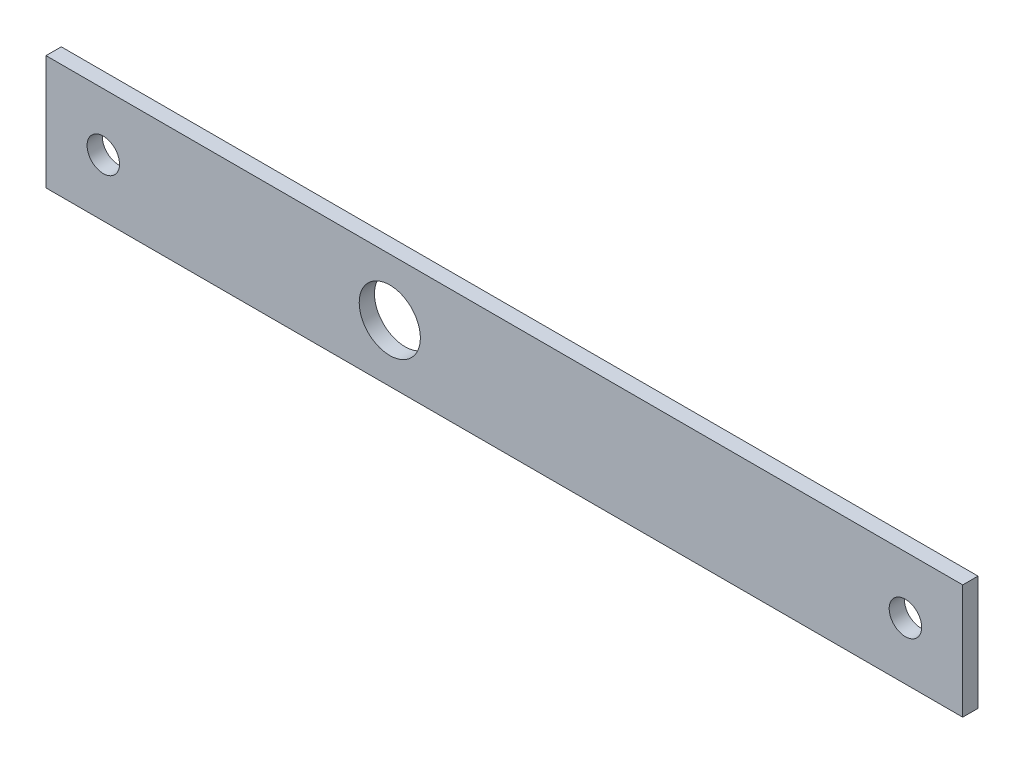
ISO-10303-21;
HEADER;
FILE_DESCRIPTION(('STEP AP214'),'2;1');
FILE_NAME('part.step','',(''),(''),'','','');
FILE_SCHEMA(('AUTOMOTIVE_DESIGN { 1 0 10303 214 1 1 1 1 }'));
ENDSEC;
DATA;
#1=APPLICATION_CONTEXT('core data for automotive mechanical design processes');
#2=APPLICATION_PROTOCOL_DEFINITION('international standard','automotive_design',2000,#1);
#3=PRODUCT_CONTEXT('',#1,'mechanical');
#4=PRODUCT('Part','Part','',(#3));
#5=PRODUCT_RELATED_PRODUCT_CATEGORY('part','',(#4));
#6=PRODUCT_DEFINITION_FORMATION('','',#4);
#7=PRODUCT_DEFINITION_CONTEXT('part definition',#1,'design');
#8=PRODUCT_DEFINITION('design','',#6,#7);
#9=PRODUCT_DEFINITION_SHAPE('','',#8);
#10=(LENGTH_UNIT() NAMED_UNIT(*) SI_UNIT(.MILLI.,.METRE.));
#11=(NAMED_UNIT(*) PLANE_ANGLE_UNIT() SI_UNIT($,.RADIAN.));
#12=(NAMED_UNIT(*) SI_UNIT($,.STERADIAN.) SOLID_ANGLE_UNIT());
#13=UNCERTAINTY_MEASURE_WITH_UNIT(LENGTH_MEASURE(1.E-05),#10,'distance_accuracy_value','');
#14=(GEOMETRIC_REPRESENTATION_CONTEXT(3) GLOBAL_UNCERTAINTY_ASSIGNED_CONTEXT((#13)) GLOBAL_UNIT_ASSIGNED_CONTEXT((#10,
#11,#12)) REPRESENTATION_CONTEXT('',''));
#15=CARTESIAN_POINT('',(0.,0.,0.));
#16=DIRECTION('',(0.,0.,1.));
#17=DIRECTION('',(1.,0.,0.));
#18=AXIS2_PLACEMENT_3D('',#15,#16,#17);
#19=CARTESIAN_POINT('',(0.,0.,4.));
#20=DIRECTION('',(1.,0.,0.));
#21=DIRECTION('',(0.,0.,-1.));
#22=AXIS2_PLACEMENT_3D('',#19,#20,#21);
#23=PLANE('',#22);
#24=DIRECTION('',(0.,-1.,0.));
#25=VECTOR('',#24,1.);
#26=CARTESIAN_POINT('',(0.,0.,0.));
#27=LINE('',#26,#25);
#28=CARTESIAN_POINT('',(0.,30.,0.));
#29=VERTEX_POINT('',#28);
#30=CARTESIAN_POINT('',(0.,0.,0.));
#31=VERTEX_POINT('',#30);
#32=EDGE_CURVE('E98',#29,#31,#27,.T.);
#33=ORIENTED_EDGE('',*,*,#32,.T.);
#34=DIRECTION('',(0.,0.,-1.));
#35=VECTOR('',#34,1.);
#36=CARTESIAN_POINT('',(0.,0.,4.));
#37=LINE('',#36,#35);
#38=CARTESIAN_POINT('',(0.,0.,4.));
#39=VERTEX_POINT('',#38);
#40=EDGE_CURVE('E11',#39,#31,#37,.T.);
#41=ORIENTED_EDGE('',*,*,#40,.F.);
#42=DIRECTION('',(0.,-1.,0.));
#43=VECTOR('',#42,1.);
#44=CARTESIAN_POINT('',(0.,0.,4.));
#45=LINE('',#44,#43);
#46=CARTESIAN_POINT('',(0.,30.,4.));
#47=VERTEX_POINT('',#46);
#48=EDGE_CURVE('E86',#47,#39,#45,.T.);
#49=ORIENTED_EDGE('',*,*,#48,.F.);
#50=DIRECTION('',(0.,0.,-1.));
#51=VECTOR('',#50,1.);
#52=CARTESIAN_POINT('',(0.,30.,4.));
#53=LINE('',#52,#51);
#54=EDGE_CURVE('E94',#47,#29,#53,.T.);
#55=ORIENTED_EDGE('',*,*,#54,.T.);
#56=EDGE_LOOP('',(#33,#41,#49,#55));
#57=FACE_BOUND('',#56,.T.);
#58=ADVANCED_FACE('F35',(#57),#23,.F.);
#59=CARTESIAN_POINT('',(0.,0.,4.));
#60=DIRECTION('',(0.,1.,0.));
#61=DIRECTION('',(0.,0.,1.));
#62=AXIS2_PLACEMENT_3D('',#59,#60,#61);
#63=PLANE('',#62);
#64=DIRECTION('',(1.,0.,0.));
#65=VECTOR('',#64,1.);
#66=CARTESIAN_POINT('',(0.,0.,0.));
#67=LINE('',#66,#65);
#68=CARTESIAN_POINT('',(240.,0.,0.));
#69=VERTEX_POINT('',#68);
#70=EDGE_CURVE('E90',#31,#69,#67,.T.);
#71=ORIENTED_EDGE('',*,*,#70,.T.);
#72=DIRECTION('',(0.,0.,-1.));
#73=VECTOR('',#72,1.);
#74=CARTESIAN_POINT('',(240.,0.,4.));
#75=LINE('',#74,#73);
#76=CARTESIAN_POINT('',(240.,0.,4.));
#77=VERTEX_POINT('',#76);
#78=EDGE_CURVE('E43',#77,#69,#75,.T.);
#79=ORIENTED_EDGE('',*,*,#78,.F.);
#80=DIRECTION('',(1.,0.,0.));
#81=VECTOR('',#80,1.);
#82=CARTESIAN_POINT('',(0.,0.,4.));
#83=LINE('',#82,#81);
#84=EDGE_CURVE('E81',#39,#77,#83,.T.);
#85=ORIENTED_EDGE('',*,*,#84,.F.);
#86=ORIENTED_EDGE('',*,*,#40,.T.);
#87=EDGE_LOOP('',(#71,#79,#85,#86));
#88=FACE_BOUND('',#87,.T.);
#89=ADVANCED_FACE('F89',(#88),#63,.F.);
#90=CARTESIAN_POINT('',(240.,0.,4.));
#91=DIRECTION('',(-1.,0.,0.));
#92=DIRECTION('',(0.,0.,1.));
#93=AXIS2_PLACEMENT_3D('',#90,#91,#92);
#94=PLANE('',#93);
#95=DIRECTION('',(0.,1.,0.));
#96=VECTOR('',#95,1.);
#97=CARTESIAN_POINT('',(240.,0.,0.));
#98=LINE('',#97,#96);
#99=CARTESIAN_POINT('',(240.,30.,0.));
#100=VERTEX_POINT('',#99);
#101=EDGE_CURVE('E68',#69,#100,#98,.T.);
#102=ORIENTED_EDGE('',*,*,#101,.T.);
#103=DIRECTION('',(0.,0.,-1.));
#104=VECTOR('',#103,1.);
#105=CARTESIAN_POINT('',(240.,30.,4.));
#106=LINE('',#105,#104);
#107=CARTESIAN_POINT('',(240.,30.,4.));
#108=VERTEX_POINT('',#107);
#109=EDGE_CURVE('E91',#108,#100,#106,.T.);
#110=ORIENTED_EDGE('',*,*,#109,.F.);
#111=DIRECTION('',(0.,1.,0.));
#112=VECTOR('',#111,1.);
#113=CARTESIAN_POINT('',(240.,0.,4.));
#114=LINE('',#113,#112);
#115=EDGE_CURVE('E84',#77,#108,#114,.T.);
#116=ORIENTED_EDGE('',*,*,#115,.F.);
#117=ORIENTED_EDGE('',*,*,#78,.T.);
#118=EDGE_LOOP('',(#102,#110,#116,#117));
#119=FACE_BOUND('',#118,.T.);
#120=ADVANCED_FACE('F92',(#119),#94,.F.);
#121=CARTESIAN_POINT('',(0.,30.,4.));
#122=DIRECTION('',(0.,-1.,0.));
#123=DIRECTION('',(0.,0.,-1.));
#124=AXIS2_PLACEMENT_3D('',#121,#122,#123);
#125=PLANE('',#124);
#126=DIRECTION('',(-1.,0.,0.));
#127=VECTOR('',#126,1.);
#128=CARTESIAN_POINT('',(0.,30.,0.));
#129=LINE('',#128,#127);
#130=EDGE_CURVE('E74',#100,#29,#129,.T.);
#131=ORIENTED_EDGE('',*,*,#130,.T.);
#132=ORIENTED_EDGE('',*,*,#54,.F.);
#133=DIRECTION('',(-1.,0.,0.));
#134=VECTOR('',#133,1.);
#135=CARTESIAN_POINT('',(0.,30.,4.));
#136=LINE('',#135,#134);
#137=EDGE_CURVE('E51',#108,#47,#136,.T.);
#138=ORIENTED_EDGE('',*,*,#137,.F.);
#139=ORIENTED_EDGE('',*,*,#109,.T.);
#140=EDGE_LOOP('',(#131,#132,#138,#139));
#141=FACE_BOUND('',#140,.T.);
#142=ADVANCED_FACE('F106',(#141),#125,.F.);
#143=CARTESIAN_POINT('',(0.,0.,4.));
#144=DIRECTION('',(0.,0.,-1.));
#145=DIRECTION('',(-1.,0.,0.));
#146=AXIS2_PLACEMENT_3D('',#143,#144,#145);
#147=PLANE('',#146);
#148=CARTESIAN_POINT('',(90.,15.,4.));
#149=DIRECTION('',(0.,0.,-1.));
#150=DIRECTION('',(-1.,0.,0.));
#151=AXIS2_PLACEMENT_3D('',#148,#149,#150);
#152=CIRCLE('',#151,8.00000000000001);
#153=CARTESIAN_POINT('',(82.,15.,4.));
#154=VERTEX_POINT('',#153);
#155=EDGE_CURVE('E116',#154,#154,#152,.T.);
#156=ORIENTED_EDGE('',*,*,#155,.T.);
#157=EDGE_LOOP('',(#156));
#158=FACE_BOUND('',#157,.T.);
#159=CARTESIAN_POINT('',(225.,15.,4.));
#160=DIRECTION('',(0.,0.,1.));
#161=DIRECTION('',(1.,0.,0.));
#162=AXIS2_PLACEMENT_3D('',#159,#160,#161);
#163=CIRCLE('',#162,4.24999999999995);
#164=CARTESIAN_POINT('',(229.25,15.,4.));
#165=VERTEX_POINT('',#164);
#166=EDGE_CURVE('E119',#165,#165,#163,.T.);
#167=ORIENTED_EDGE('',*,*,#166,.F.);
#168=EDGE_LOOP('',(#167));
#169=FACE_BOUND('',#168,.T.);
#170=CARTESIAN_POINT('',(15.,15.,4.));
#171=DIRECTION('',(0.,0.,1.));
#172=DIRECTION('',(1.,0.,0.));
#173=AXIS2_PLACEMENT_3D('',#170,#171,#172);
#174=CIRCLE('',#173,4.25);
#175=CARTESIAN_POINT('',(19.25,15.,4.));
#176=VERTEX_POINT('',#175);
#177=EDGE_CURVE('E112',#176,#176,#174,.T.);
#178=ORIENTED_EDGE('',*,*,#177,.F.);
#179=EDGE_LOOP('',(#178));
#180=FACE_BOUND('',#179,.T.);
#181=ORIENTED_EDGE('',*,*,#48,.T.);
#182=ORIENTED_EDGE('',*,*,#84,.T.);
#183=ORIENTED_EDGE('',*,*,#115,.T.);
#184=ORIENTED_EDGE('',*,*,#137,.T.);
#185=EDGE_LOOP('',(#181,#182,#183,#184));
#186=FACE_BOUND('',#185,.T.);
#187=ADVANCED_FACE('F82',(#158,#169,#180,#186),#147,.F.);
#188=CARTESIAN_POINT('',(0.,0.,0.));
#189=DIRECTION('',(0.,0.,-1.));
#190=DIRECTION('',(-1.,0.,0.));
#191=AXIS2_PLACEMENT_3D('',#188,#189,#190);
#192=PLANE('',#191);
#193=CARTESIAN_POINT('',(90.,15.,0.));
#194=DIRECTION('',(0.,0.,-1.));
#195=DIRECTION('',(-1.,0.,0.));
#196=AXIS2_PLACEMENT_3D('',#193,#194,#195);
#197=CIRCLE('',#196,8.00000000000001);
#198=CARTESIAN_POINT('',(82.,15.,0.));
#199=VERTEX_POINT('',#198);
#200=EDGE_CURVE('E124',#199,#199,#197,.T.);
#201=ORIENTED_EDGE('',*,*,#200,.F.);
#202=EDGE_LOOP('',(#201));
#203=FACE_BOUND('',#202,.T.);
#204=CARTESIAN_POINT('',(225.,15.,0.));
#205=DIRECTION('',(0.,0.,1.));
#206=DIRECTION('',(1.,0.,0.));
#207=AXIS2_PLACEMENT_3D('',#204,#205,#206);
#208=CIRCLE('',#207,4.24999999999995);
#209=CARTESIAN_POINT('',(229.25,15.,0.));
#210=VERTEX_POINT('',#209);
#211=EDGE_CURVE('E101',#210,#210,#208,.T.);
#212=ORIENTED_EDGE('',*,*,#211,.T.);
#213=EDGE_LOOP('',(#212));
#214=FACE_BOUND('',#213,.T.);
#215=CARTESIAN_POINT('',(15.,15.,0.));
#216=DIRECTION('',(0.,0.,1.));
#217=DIRECTION('',(1.,0.,0.));
#218=AXIS2_PLACEMENT_3D('',#215,#216,#217);
#219=CIRCLE('',#218,4.25);
#220=CARTESIAN_POINT('',(19.25,15.,0.));
#221=VERTEX_POINT('',#220);
#222=EDGE_CURVE('E115',#221,#221,#219,.T.);
#223=ORIENTED_EDGE('',*,*,#222,.T.);
#224=EDGE_LOOP('',(#223));
#225=FACE_BOUND('',#224,.T.);
#226=ORIENTED_EDGE('',*,*,#32,.F.);
#227=ORIENTED_EDGE('',*,*,#130,.F.);
#228=ORIENTED_EDGE('',*,*,#101,.F.);
#229=ORIENTED_EDGE('',*,*,#70,.F.);
#230=EDGE_LOOP('',(#226,#227,#228,#229));
#231=FACE_BOUND('',#230,.T.);
#232=ADVANCED_FACE('F109',(#203,#214,#225,#231),#192,.T.);
#233=CARTESIAN_POINT('',(15.,15.,0.));
#234=DIRECTION('',(0.,0.,1.));
#235=DIRECTION('',(1.,0.,0.));
#236=AXIS2_PLACEMENT_3D('',#233,#234,#235);
#237=CYLINDRICAL_SURFACE('',#236,4.25);
#238=ORIENTED_EDGE('',*,*,#222,.F.);
#239=EDGE_LOOP('',(#238));
#240=FACE_BOUND('',#239,.T.);
#241=ORIENTED_EDGE('',*,*,#177,.T.);
#242=EDGE_LOOP('',(#241));
#243=FACE_BOUND('',#242,.T.);
#244=ADVANCED_FACE('F141',(#240,#243),#237,.F.);
#245=CARTESIAN_POINT('',(225.,15.,0.));
#246=DIRECTION('',(0.,0.,1.));
#247=DIRECTION('',(1.,0.,0.));
#248=AXIS2_PLACEMENT_3D('',#245,#246,#247);
#249=CYLINDRICAL_SURFACE('',#248,4.24999999999995);
#250=ORIENTED_EDGE('',*,*,#211,.F.);
#251=EDGE_LOOP('',(#250));
#252=FACE_BOUND('',#251,.T.);
#253=ORIENTED_EDGE('',*,*,#166,.T.);
#254=EDGE_LOOP('',(#253));
#255=FACE_BOUND('',#254,.T.);
#256=ADVANCED_FACE('F135',(#252,#255),#249,.F.);
#257=CARTESIAN_POINT('',(90.,15.,4.));
#258=DIRECTION('',(0.,0.,-1.));
#259=DIRECTION('',(-1.,0.,0.));
#260=AXIS2_PLACEMENT_3D('',#257,#258,#259);
#261=CYLINDRICAL_SURFACE('',#260,8.00000000000001);
#262=ORIENTED_EDGE('',*,*,#155,.F.);
#263=EDGE_LOOP('',(#262));
#264=FACE_BOUND('',#263,.T.);
#265=ORIENTED_EDGE('',*,*,#200,.T.);
#266=EDGE_LOOP('',(#265));
#267=FACE_BOUND('',#266,.T.);
#268=ADVANCED_FACE('F132',(#264,#267),#261,.F.);
#269=CLOSED_SHELL('',(#58,#89,#120,#142,#187,#232,#244,#256,#268));
#270=MANIFOLD_SOLID_BREP('B2',#269);
#271=ADVANCED_BREP_SHAPE_REPRESENTATION('',(#18,#270),#14);
#272=SHAPE_DEFINITION_REPRESENTATION(#9,#271);
ENDSEC;
END-ISO-10303-21;
